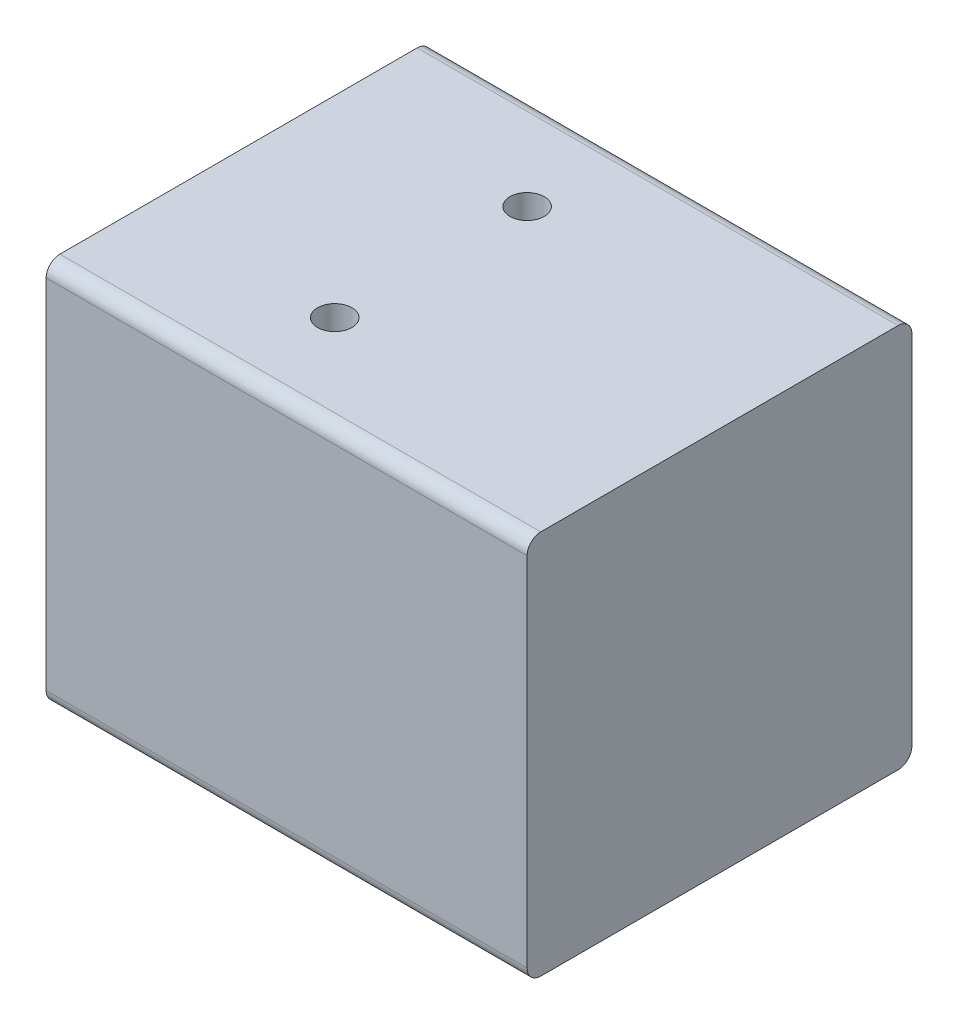
ISO-10303-21;
HEADER;
FILE_DESCRIPTION(('STEP AP214'),'2;1');
FILE_NAME('part.step','',(''),(''),'','','');
FILE_SCHEMA(('AUTOMOTIVE_DESIGN { 1 0 10303 214 1 1 1 1 }'));
ENDSEC;
DATA;
#1=APPLICATION_CONTEXT('core data for automotive mechanical design processes');
#2=APPLICATION_PROTOCOL_DEFINITION('international standard','automotive_design',2000,#1);
#3=PRODUCT_CONTEXT('',#1,'mechanical');
#4=PRODUCT('Part','Part','',(#3));
#5=PRODUCT_RELATED_PRODUCT_CATEGORY('part','',(#4));
#6=PRODUCT_DEFINITION_FORMATION('','',#4);
#7=PRODUCT_DEFINITION_CONTEXT('part definition',#1,'design');
#8=PRODUCT_DEFINITION('design','',#6,#7);
#9=PRODUCT_DEFINITION_SHAPE('','',#8);
#10=(LENGTH_UNIT() NAMED_UNIT(*) SI_UNIT(.MILLI.,.METRE.));
#11=(NAMED_UNIT(*) PLANE_ANGLE_UNIT() SI_UNIT($,.RADIAN.));
#12=(NAMED_UNIT(*) SI_UNIT($,.STERADIAN.) SOLID_ANGLE_UNIT());
#13=UNCERTAINTY_MEASURE_WITH_UNIT(LENGTH_MEASURE(1.E-05),#10,'distance_accuracy_value','');
#14=(GEOMETRIC_REPRESENTATION_CONTEXT(3) GLOBAL_UNCERTAINTY_ASSIGNED_CONTEXT((#13)) GLOBAL_UNIT_ASSIGNED_CONTEXT((#10,
#11,#12)) REPRESENTATION_CONTEXT('',''));
#15=CARTESIAN_POINT('',(0.,0.,0.));
#16=DIRECTION('',(0.,0.,1.));
#17=DIRECTION('',(1.,0.,0.));
#18=AXIS2_PLACEMENT_3D('',#15,#16,#17);
#19=CARTESIAN_POINT('',(-55.5625,88.9,88.9));
#20=DIRECTION('',(1.,0.,0.));
#21=DIRECTION('',(0.,1.,0.));
#22=AXIS2_PLACEMENT_3D('',#19,#20,#21);
#23=PLANE('',#22);
#24=DIRECTION('',(0.,-1.,0.));
#25=VECTOR('',#24,1.);
#26=CARTESIAN_POINT('',(-55.5625,88.9,0.));
#27=LINE('',#26,#25);
#28=CARTESIAN_POINT('',(-55.5625,85.725,0.));
#29=VERTEX_POINT('',#28);
#30=CARTESIAN_POINT('',(-55.5625,3.175,0.));
#31=VERTEX_POINT('',#30);
#32=EDGE_CURVE('E169',#29,#31,#27,.T.);
#33=ORIENTED_EDGE('',*,*,#32,.T.);
#34=CARTESIAN_POINT('',(-55.5625,3.175,3.175));
#35=DIRECTION('',(1.,0.,0.));
#36=DIRECTION('',(0.,1.,0.));
#37=AXIS2_PLACEMENT_3D('',#34,#35,#36);
#38=CIRCLE('',#37,3.175);
#39=CARTESIAN_POINT('',(-55.5625,0.,3.175));
#40=VERTEX_POINT('',#39);
#41=EDGE_CURVE('E143',#31,#40,#38,.F.);
#42=ORIENTED_EDGE('',*,*,#41,.T.);
#43=DIRECTION('',(0.,0.,-1.));
#44=VECTOR('',#43,1.);
#45=CARTESIAN_POINT('',(-55.5625,0.,88.9));
#46=LINE('',#45,#44);
#47=CARTESIAN_POINT('',(-55.5625,0.,85.725));
#48=VERTEX_POINT('',#47);
#49=EDGE_CURVE('E122',#48,#40,#46,.T.);
#50=ORIENTED_EDGE('',*,*,#49,.F.);
#51=CARTESIAN_POINT('',(-55.5625,3.175,85.725));
#52=DIRECTION('',(1.,0.,0.));
#53=DIRECTION('',(0.,1.,0.));
#54=AXIS2_PLACEMENT_3D('',#51,#52,#53);
#55=CIRCLE('',#54,3.175);
#56=CARTESIAN_POINT('',(-55.5625,3.175,88.9));
#57=VERTEX_POINT('',#56);
#58=EDGE_CURVE('E127',#48,#57,#55,.F.);
#59=ORIENTED_EDGE('',*,*,#58,.T.);
#60=DIRECTION('',(0.,-1.,0.));
#61=VECTOR('',#60,1.);
#62=CARTESIAN_POINT('',(-55.5625,88.9,88.9));
#63=LINE('',#62,#61);
#64=CARTESIAN_POINT('',(-55.5625,85.725,88.9));
#65=VERTEX_POINT('',#64);
#66=EDGE_CURVE('E164',#65,#57,#63,.T.);
#67=ORIENTED_EDGE('',*,*,#66,.F.);
#68=CARTESIAN_POINT('',(-55.5625,85.725,85.725));
#69=DIRECTION('',(1.,0.,0.));
#70=DIRECTION('',(0.,1.,0.));
#71=AXIS2_PLACEMENT_3D('',#68,#69,#70);
#72=CIRCLE('',#71,3.175);
#73=CARTESIAN_POINT('',(-55.5625,88.9,85.725));
#74=VERTEX_POINT('',#73);
#75=EDGE_CURVE('E57',#65,#74,#72,.F.);
#76=ORIENTED_EDGE('',*,*,#75,.T.);
#77=DIRECTION('',(0.,0.,-1.));
#78=VECTOR('',#77,1.);
#79=CARTESIAN_POINT('',(-55.5625,88.9,88.9));
#80=LINE('',#79,#78);
#81=CARTESIAN_POINT('',(-55.5625,88.9,3.175));
#82=VERTEX_POINT('',#81);
#83=EDGE_CURVE('E154',#74,#82,#80,.T.);
#84=ORIENTED_EDGE('',*,*,#83,.T.);
#85=CARTESIAN_POINT('',(-55.5625,85.725,3.175));
#86=DIRECTION('',(1.,0.,0.));
#87=DIRECTION('',(0.,1.,0.));
#88=AXIS2_PLACEMENT_3D('',#85,#86,#87);
#89=CIRCLE('',#88,3.175);
#90=EDGE_CURVE('E50',#82,#29,#89,.F.);
#91=ORIENTED_EDGE('',*,*,#90,.T.);
#92=EDGE_LOOP('',(#33,#42,#50,#59,#67,#76,#84,#91));
#93=FACE_BOUND('',#92,.T.);
#94=ADVANCED_FACE('F35',(#93),#23,.F.);
#95=CARTESIAN_POINT('',(-55.5625,0.,88.9));
#96=DIRECTION('',(0.,1.,0.));
#97=DIRECTION('',(-1.,0.,0.));
#98=AXIS2_PLACEMENT_3D('',#95,#96,#97);
#99=PLANE('',#98);
#100=CARTESIAN_POINT('',(-11.1125,0.,22.225));
#101=DIRECTION('',(0.,1.,0.));
#102=DIRECTION('',(-1.,0.,0.));
#103=AXIS2_PLACEMENT_3D('',#100,#101,#102);
#104=CIRCLE('',#103,3.96874999999998);
#105=CARTESIAN_POINT('',(-15.08125,0.,22.225));
#106=VERTEX_POINT('',#105);
#107=EDGE_CURVE('E290',#106,#106,#104,.T.);
#108=ORIENTED_EDGE('',*,*,#107,.T.);
#109=EDGE_LOOP('',(#108));
#110=FACE_BOUND('',#109,.T.);
#111=CARTESIAN_POINT('',(-11.1125,0.,66.675));
#112=DIRECTION('',(0.,1.,0.));
#113=DIRECTION('',(-1.,0.,0.));
#114=AXIS2_PLACEMENT_3D('',#111,#112,#113);
#115=CIRCLE('',#114,3.96874999999998);
#116=CARTESIAN_POINT('',(-15.08125,0.,66.675));
#117=VERTEX_POINT('',#116);
#118=EDGE_CURVE('E172',#117,#117,#115,.T.);
#119=ORIENTED_EDGE('',*,*,#118,.T.);
#120=EDGE_LOOP('',(#119));
#121=FACE_BOUND('',#120,.T.);
#122=ORIENTED_EDGE('',*,*,#49,.T.);
#123=DIRECTION('',(1.,0.,0.));
#124=VECTOR('',#123,1.);
#125=CARTESIAN_POINT('',(-55.5625,0.,3.175));
#126=LINE('',#125,#124);
#127=CARTESIAN_POINT('',(55.5625,0.,3.175));
#128=VERTEX_POINT('',#127);
#129=EDGE_CURVE('E121',#40,#128,#126,.T.);
#130=ORIENTED_EDGE('',*,*,#129,.T.);
#131=DIRECTION('',(0.,0.,-1.));
#132=VECTOR('',#131,1.);
#133=CARTESIAN_POINT('',(55.5625,0.,88.9));
#134=LINE('',#133,#132);
#135=CARTESIAN_POINT('',(55.5625,0.,85.725));
#136=VERTEX_POINT('',#135);
#137=EDGE_CURVE('E104',#136,#128,#134,.T.);
#138=ORIENTED_EDGE('',*,*,#137,.F.);
#139=DIRECTION('',(1.,0.,0.));
#140=VECTOR('',#139,1.);
#141=CARTESIAN_POINT('',(-55.5625,0.,85.725));
#142=LINE('',#141,#140);
#143=EDGE_CURVE('E118',#136,#48,#142,.F.);
#144=ORIENTED_EDGE('',*,*,#143,.T.);
#145=EDGE_LOOP('',(#122,#130,#138,#144));
#146=FACE_BOUND('',#145,.T.);
#147=ADVANCED_FACE('F117',(#110,#121,#146),#99,.F.);
#148=CARTESIAN_POINT('',(55.5625,88.9,88.9));
#149=DIRECTION('',(-1.,0.,0.));
#150=DIRECTION('',(0.,-1.,0.));
#151=AXIS2_PLACEMENT_3D('',#148,#149,#150);
#152=PLANE('',#151);
#153=ORIENTED_EDGE('',*,*,#137,.T.);
#154=CARTESIAN_POINT('',(55.5625,3.17500000000002,3.175));
#155=DIRECTION('',(-1.,0.,0.));
#156=DIRECTION('',(0.,-1.,0.));
#157=AXIS2_PLACEMENT_3D('',#154,#155,#156);
#158=CIRCLE('',#157,3.175);
#159=CARTESIAN_POINT('',(55.5625,3.17500000000003,0.));
#160=VERTEX_POINT('',#159);
#161=EDGE_CURVE('E111',#128,#160,#158,.F.);
#162=ORIENTED_EDGE('',*,*,#161,.T.);
#163=DIRECTION('',(0.,1.,0.));
#164=VECTOR('',#163,1.);
#165=CARTESIAN_POINT('',(55.5625,88.9,0.));
#166=LINE('',#165,#164);
#167=CARTESIAN_POINT('',(55.5625,85.725,0.));
#168=VERTEX_POINT('',#167);
#169=EDGE_CURVE('E166',#160,#168,#166,.T.);
#170=ORIENTED_EDGE('',*,*,#169,.T.);
#171=CARTESIAN_POINT('',(55.5625,85.725,3.175));
#172=DIRECTION('',(-1.,0.,0.));
#173=DIRECTION('',(0.,-1.,0.));
#174=AXIS2_PLACEMENT_3D('',#171,#172,#173);
#175=CIRCLE('',#174,3.175);
#176=CARTESIAN_POINT('',(55.5625,88.9,3.175));
#177=VERTEX_POINT('',#176);
#178=EDGE_CURVE('E112',#168,#177,#175,.F.);
#179=ORIENTED_EDGE('',*,*,#178,.T.);
#180=DIRECTION('',(0.,0.,-1.));
#181=VECTOR('',#180,1.);
#182=CARTESIAN_POINT('',(55.5625,88.9,88.9));
#183=LINE('',#182,#181);
#184=CARTESIAN_POINT('',(55.5625,88.9,85.725));
#185=VERTEX_POINT('',#184);
#186=EDGE_CURVE('E123',#185,#177,#183,.T.);
#187=ORIENTED_EDGE('',*,*,#186,.F.);
#188=CARTESIAN_POINT('',(55.5625,85.725,85.725));
#189=DIRECTION('',(-1.,0.,0.));
#190=DIRECTION('',(0.,-1.,0.));
#191=AXIS2_PLACEMENT_3D('',#188,#189,#190);
#192=CIRCLE('',#191,3.175);
#193=CARTESIAN_POINT('',(55.5625,85.725,88.9));
#194=VERTEX_POINT('',#193);
#195=EDGE_CURVE('E129',#185,#194,#192,.F.);
#196=ORIENTED_EDGE('',*,*,#195,.T.);
#197=DIRECTION('',(0.,1.,0.));
#198=VECTOR('',#197,1.);
#199=CARTESIAN_POINT('',(55.5625,88.9,88.9));
#200=LINE('',#199,#198);
#201=CARTESIAN_POINT('',(55.5625,3.17500000000003,88.9));
#202=VERTEX_POINT('',#201);
#203=EDGE_CURVE('E106',#202,#194,#200,.T.);
#204=ORIENTED_EDGE('',*,*,#203,.F.);
#205=CARTESIAN_POINT('',(55.5625,3.17500000000002,85.725));
#206=DIRECTION('',(-1.,0.,0.));
#207=DIRECTION('',(0.,-1.,0.));
#208=AXIS2_PLACEMENT_3D('',#205,#206,#207);
#209=CIRCLE('',#208,3.175);
#210=EDGE_CURVE('E101',#202,#136,#209,.F.);
#211=ORIENTED_EDGE('',*,*,#210,.T.);
#212=EDGE_LOOP('',(#153,#162,#170,#179,#187,#196,#204,#211));
#213=FACE_BOUND('',#212,.T.);
#214=ADVANCED_FACE('F103',(#213),#152,.F.);
#215=CARTESIAN_POINT('',(-55.5625,88.9,88.9));
#216=DIRECTION('',(0.,-1.,0.));
#217=DIRECTION('',(1.,0.,0.));
#218=AXIS2_PLACEMENT_3D('',#215,#216,#217);
#219=PLANE('',#218);
#220=CARTESIAN_POINT('',(-11.1125,88.9,22.225));
#221=DIRECTION('',(0.,1.,0.));
#222=DIRECTION('',(0.,0.,1.));
#223=AXIS2_PLACEMENT_3D('',#220,#221,#222);
#224=CIRCLE('',#223,3.96874999999999);
#225=CARTESIAN_POINT('',(-11.1125,88.9,26.19375));
#226=VERTEX_POINT('',#225);
#227=EDGE_CURVE('E293',#226,#226,#224,.T.);
#228=ORIENTED_EDGE('',*,*,#227,.F.);
#229=EDGE_LOOP('',(#228));
#230=FACE_BOUND('',#229,.T.);
#231=CARTESIAN_POINT('',(-11.1125,88.9,66.675));
#232=DIRECTION('',(0.,1.,0.));
#233=DIRECTION('',(0.,0.,1.));
#234=AXIS2_PLACEMENT_3D('',#231,#232,#233);
#235=CIRCLE('',#234,3.96874999999999);
#236=CARTESIAN_POINT('',(-11.1125,88.9,70.64375));
#237=VERTEX_POINT('',#236);
#238=EDGE_CURVE('E295',#237,#237,#235,.T.);
#239=ORIENTED_EDGE('',*,*,#238,.F.);
#240=EDGE_LOOP('',(#239));
#241=FACE_BOUND('',#240,.T.);
#242=ORIENTED_EDGE('',*,*,#186,.T.);
#243=DIRECTION('',(-1.,0.,0.));
#244=VECTOR('',#243,1.);
#245=CARTESIAN_POINT('',(-55.5625,88.9,3.175));
#246=LINE('',#245,#244);
#247=EDGE_CURVE('E11',#177,#82,#246,.T.);
#248=ORIENTED_EDGE('',*,*,#247,.T.);
#249=ORIENTED_EDGE('',*,*,#83,.F.);
#250=DIRECTION('',(-1.,0.,0.));
#251=VECTOR('',#250,1.);
#252=CARTESIAN_POINT('',(55.5625,88.9,85.725));
#253=LINE('',#252,#251);
#254=EDGE_CURVE('E43',#74,#185,#253,.F.);
#255=ORIENTED_EDGE('',*,*,#254,.T.);
#256=EDGE_LOOP('',(#242,#248,#249,#255));
#257=FACE_BOUND('',#256,.T.);
#258=ADVANCED_FACE('F153',(#230,#241,#257),#219,.F.);
#259=CARTESIAN_POINT('',(0.,0.,88.9));
#260=DIRECTION('',(0.,0.,1.));
#261=DIRECTION('',(1.,0.,0.));
#262=AXIS2_PLACEMENT_3D('',#259,#260,#261);
#263=PLANE('',#262);
#264=ORIENTED_EDGE('',*,*,#66,.T.);
#265=DIRECTION('',(1.,0.,0.));
#266=VECTOR('',#265,1.);
#267=CARTESIAN_POINT('',(55.5625,3.17500000000002,88.9));
#268=LINE('',#267,#266);
#269=EDGE_CURVE('E148',#57,#202,#268,.T.);
#270=ORIENTED_EDGE('',*,*,#269,.T.);
#271=ORIENTED_EDGE('',*,*,#203,.T.);
#272=DIRECTION('',(-1.,0.,0.));
#273=VECTOR('',#272,1.);
#274=CARTESIAN_POINT('',(-55.5625,85.725,88.9));
#275=LINE('',#274,#273);
#276=EDGE_CURVE('E145',#194,#65,#275,.T.);
#277=ORIENTED_EDGE('',*,*,#276,.T.);
#278=EDGE_LOOP('',(#264,#270,#271,#277));
#279=FACE_BOUND('',#278,.T.);
#280=ADVANCED_FACE('F163',(#279),#263,.T.);
#281=CARTESIAN_POINT('',(0.,0.,0.));
#282=DIRECTION('',(0.,0.,1.));
#283=DIRECTION('',(1.,0.,0.));
#284=AXIS2_PLACEMENT_3D('',#281,#282,#283);
#285=PLANE('',#284);
#286=ORIENTED_EDGE('',*,*,#169,.F.);
#287=DIRECTION('',(1.,0.,0.));
#288=VECTOR('',#287,1.);
#289=CARTESIAN_POINT('',(0.,3.17500000000001,0.));
#290=LINE('',#289,#288);
#291=EDGE_CURVE('E138',#160,#31,#290,.F.);
#292=ORIENTED_EDGE('',*,*,#291,.T.);
#293=ORIENTED_EDGE('',*,*,#32,.F.);
#294=DIRECTION('',(-1.,0.,0.));
#295=VECTOR('',#294,1.);
#296=CARTESIAN_POINT('',(0.,85.725,0.));
#297=LINE('',#296,#295);
#298=EDGE_CURVE('E136',#29,#168,#297,.F.);
#299=ORIENTED_EDGE('',*,*,#298,.T.);
#300=EDGE_LOOP('',(#286,#292,#293,#299));
#301=FACE_BOUND('',#300,.T.);
#302=ADVANCED_FACE('F180',(#301),#285,.F.);
#303=CARTESIAN_POINT('',(-55.5625,3.175,3.175));
#304=DIRECTION('',(1.,0.,0.));
#305=DIRECTION('',(0.,1.,0.));
#306=AXIS2_PLACEMENT_3D('',#303,#304,#305);
#307=CYLINDRICAL_SURFACE('',#306,3.175);
#308=ORIENTED_EDGE('',*,*,#41,.F.);
#309=ORIENTED_EDGE('',*,*,#291,.F.);
#310=ORIENTED_EDGE('',*,*,#161,.F.);
#311=ORIENTED_EDGE('',*,*,#129,.F.);
#312=EDGE_LOOP('',(#308,#309,#310,#311));
#313=FACE_BOUND('',#312,.T.);
#314=ADVANCED_FACE('F189',(#313),#307,.T.);
#315=CARTESIAN_POINT('',(0.,3.17500000000001,85.725));
#316=DIRECTION('',(-1.,0.,0.));
#317=DIRECTION('',(0.,-1.,0.));
#318=AXIS2_PLACEMENT_3D('',#315,#316,#317);
#319=CYLINDRICAL_SURFACE('',#318,3.175);
#320=ORIENTED_EDGE('',*,*,#58,.F.);
#321=ORIENTED_EDGE('',*,*,#143,.F.);
#322=ORIENTED_EDGE('',*,*,#210,.F.);
#323=ORIENTED_EDGE('',*,*,#269,.F.);
#324=EDGE_LOOP('',(#320,#321,#322,#323));
#325=FACE_BOUND('',#324,.T.);
#326=ADVANCED_FACE('F126',(#325),#319,.T.);
#327=CARTESIAN_POINT('',(-55.5625,85.725,3.175));
#328=DIRECTION('',(-1.,0.,0.));
#329=DIRECTION('',(0.,-1.,0.));
#330=AXIS2_PLACEMENT_3D('',#327,#328,#329);
#331=CYLINDRICAL_SURFACE('',#330,3.175);
#332=ORIENTED_EDGE('',*,*,#178,.F.);
#333=ORIENTED_EDGE('',*,*,#298,.F.);
#334=ORIENTED_EDGE('',*,*,#90,.F.);
#335=ORIENTED_EDGE('',*,*,#247,.F.);
#336=EDGE_LOOP('',(#332,#333,#334,#335));
#337=FACE_BOUND('',#336,.T.);
#338=ADVANCED_FACE('F182',(#337),#331,.T.);
#339=CARTESIAN_POINT('',(0.,85.725,85.725));
#340=DIRECTION('',(1.,0.,0.));
#341=DIRECTION('',(0.,1.,0.));
#342=AXIS2_PLACEMENT_3D('',#339,#340,#341);
#343=CYLINDRICAL_SURFACE('',#342,3.175);
#344=ORIENTED_EDGE('',*,*,#195,.F.);
#345=ORIENTED_EDGE('',*,*,#254,.F.);
#346=ORIENTED_EDGE('',*,*,#75,.F.);
#347=ORIENTED_EDGE('',*,*,#276,.F.);
#348=EDGE_LOOP('',(#344,#345,#346,#347));
#349=FACE_BOUND('',#348,.T.);
#350=ADVANCED_FACE('F37',(#349),#343,.T.);
#351=CARTESIAN_POINT('',(-11.1125,88.9,66.675));
#352=DIRECTION('',(0.,1.,0.));
#353=DIRECTION('',(0.,0.,1.));
#354=AXIS2_PLACEMENT_3D('',#351,#352,#353);
#355=CYLINDRICAL_SURFACE('',#354,3.96874999999998);
#356=ORIENTED_EDGE('',*,*,#118,.F.);
#357=EDGE_LOOP('',(#356));
#358=FACE_BOUND('',#357,.T.);
#359=ORIENTED_EDGE('',*,*,#238,.T.);
#360=EDGE_LOOP('',(#359));
#361=FACE_BOUND('',#360,.T.);
#362=ADVANCED_FACE('F188',(#358,#361),#355,.F.);
#363=CARTESIAN_POINT('',(-11.1125,88.9,22.225));
#364=DIRECTION('',(0.,1.,0.));
#365=DIRECTION('',(0.,0.,1.));
#366=AXIS2_PLACEMENT_3D('',#363,#364,#365);
#367=CYLINDRICAL_SURFACE('',#366,3.96874999999998);
#368=ORIENTED_EDGE('',*,*,#107,.F.);
#369=EDGE_LOOP('',(#368));
#370=FACE_BOUND('',#369,.T.);
#371=ORIENTED_EDGE('',*,*,#227,.T.);
#372=EDGE_LOOP('',(#371));
#373=FACE_BOUND('',#372,.T.);
#374=ADVANCED_FACE('F274',(#370,#373),#367,.F.);
#375=CLOSED_SHELL('',(#94,#147,#214,#258,#280,#302,#314,#326,#338,#350,#362,#374));
#376=MANIFOLD_SOLID_BREP('B2',#375);
#377=ADVANCED_BREP_SHAPE_REPRESENTATION('',(#18,#376),#14);
#378=SHAPE_DEFINITION_REPRESENTATION(#9,#377);
ENDSEC;
END-ISO-10303-21;
